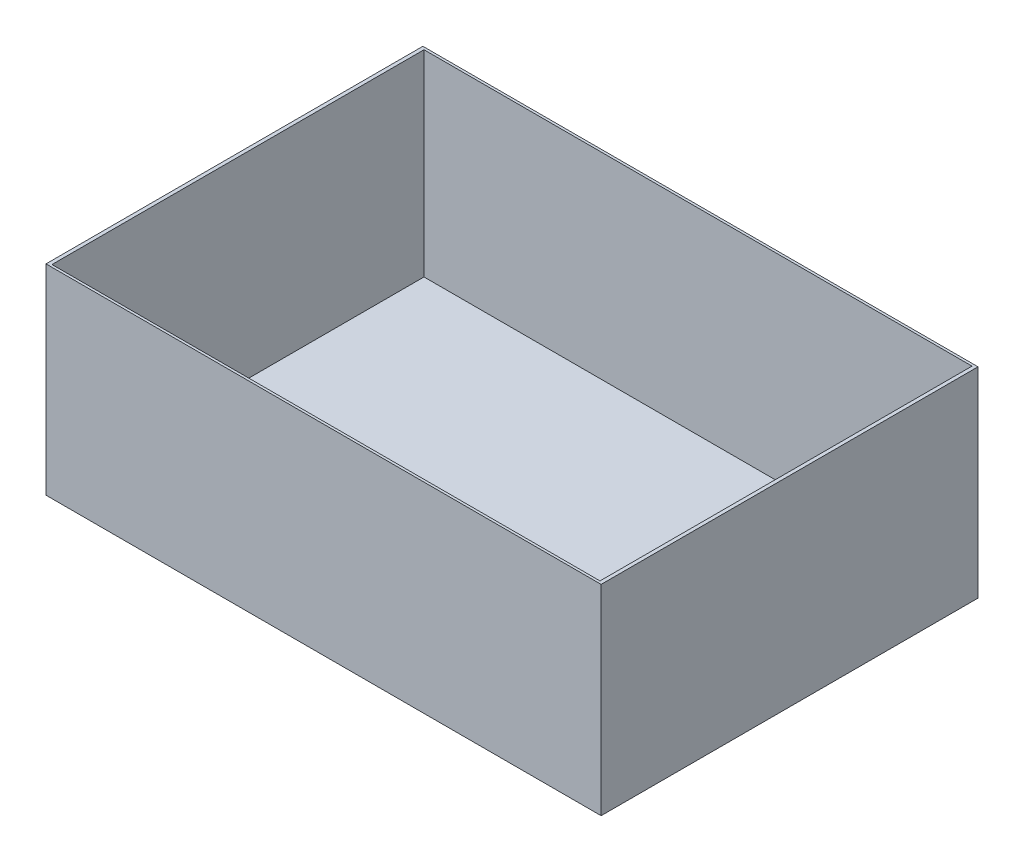
ISO-10303-21;
HEADER;
FILE_DESCRIPTION(('STEP AP214'),'2;1');
FILE_NAME('part.step','',(''),(''),'','','');
FILE_SCHEMA(('AUTOMOTIVE_DESIGN { 1 0 10303 214 1 1 1 1 }'));
ENDSEC;
DATA;
#1=APPLICATION_CONTEXT('core data for automotive mechanical design processes');
#2=APPLICATION_PROTOCOL_DEFINITION('international standard','automotive_design',2000,#1);
#3=PRODUCT_CONTEXT('',#1,'mechanical');
#4=PRODUCT('Part','Part','',(#3));
#5=PRODUCT_RELATED_PRODUCT_CATEGORY('part','',(#4));
#6=PRODUCT_DEFINITION_FORMATION('','',#4);
#7=PRODUCT_DEFINITION_CONTEXT('part definition',#1,'design');
#8=PRODUCT_DEFINITION('design','',#6,#7);
#9=PRODUCT_DEFINITION_SHAPE('','',#8);
#10=(LENGTH_UNIT() NAMED_UNIT(*) SI_UNIT(.MILLI.,.METRE.));
#11=(NAMED_UNIT(*) PLANE_ANGLE_UNIT() SI_UNIT($,.RADIAN.));
#12=(NAMED_UNIT(*) SI_UNIT($,.STERADIAN.) SOLID_ANGLE_UNIT());
#13=UNCERTAINTY_MEASURE_WITH_UNIT(LENGTH_MEASURE(1.E-05),#10,'distance_accuracy_value','');
#14=(GEOMETRIC_REPRESENTATION_CONTEXT(3) GLOBAL_UNCERTAINTY_ASSIGNED_CONTEXT((#13)) GLOBAL_UNIT_ASSIGNED_CONTEXT((#10,
#11,#12)) REPRESENTATION_CONTEXT('',''));
#15=CARTESIAN_POINT('',(0.,0.,0.));
#16=DIRECTION('',(0.,0.,1.));
#17=DIRECTION('',(1.,0.,0.));
#18=AXIS2_PLACEMENT_3D('',#15,#16,#17);
#19=CARTESIAN_POINT('',(249.22,3.2,-169.19));
#20=DIRECTION('',(-1.,0.,0.));
#21=DIRECTION('',(0.,0.,1.));
#22=AXIS2_PLACEMENT_3D('',#19,#20,#21);
#23=PLANE('',#22);
#24=DIRECTION('',(0.,0.,-1.));
#25=VECTOR('',#24,1.);
#26=CARTESIAN_POINT('',(249.22,0.,-169.19));
#27=LINE('',#26,#25);
#28=CARTESIAN_POINT('',(249.22,0.,169.19));
#29=VERTEX_POINT('',#28);
#30=CARTESIAN_POINT('',(249.22,0.,-169.19));
#31=VERTEX_POINT('',#30);
#32=EDGE_CURVE('E173',#29,#31,#27,.T.);
#33=ORIENTED_EDGE('',*,*,#32,.T.);
#34=DIRECTION('',(0.,-1.,0.));
#35=VECTOR('',#34,1.);
#36=CARTESIAN_POINT('',(249.22,3.2,-169.19));
#37=LINE('',#36,#35);
#38=CARTESIAN_POINT('',(249.22,179.9,-169.19));
#39=VERTEX_POINT('',#38);
#40=EDGE_CURVE('E11',#39,#31,#37,.T.);
#41=ORIENTED_EDGE('',*,*,#40,.F.);
#42=DIRECTION('',(0.,0.,-1.));
#43=VECTOR('',#42,1.);
#44=CARTESIAN_POINT('',(249.22,179.9,169.19));
#45=LINE('',#44,#43);
#46=CARTESIAN_POINT('',(249.22,179.9,169.19));
#47=VERTEX_POINT('',#46);
#48=EDGE_CURVE('E126',#47,#39,#45,.T.);
#49=ORIENTED_EDGE('',*,*,#48,.F.);
#50=DIRECTION('',(0.,-1.,0.));
#51=VECTOR('',#50,1.);
#52=CARTESIAN_POINT('',(249.22,3.2,169.19));
#53=LINE('',#52,#51);
#54=EDGE_CURVE('E186',#47,#29,#53,.T.);
#55=ORIENTED_EDGE('',*,*,#54,.T.);
#56=EDGE_LOOP('',(#33,#41,#49,#55));
#57=FACE_BOUND('',#56,.T.);
#58=ADVANCED_FACE('F45',(#57),#23,.F.);
#59=CARTESIAN_POINT('',(-249.22,3.2,-169.19));
#60=DIRECTION('',(0.,0.,1.));
#61=DIRECTION('',(1.,0.,0.));
#62=AXIS2_PLACEMENT_3D('',#59,#60,#61);
#63=PLANE('',#62);
#64=DIRECTION('',(-1.,0.,0.));
#65=VECTOR('',#64,1.);
#66=CARTESIAN_POINT('',(-249.22,0.,-169.19));
#67=LINE('',#66,#65);
#68=CARTESIAN_POINT('',(-249.22,0.,-169.19));
#69=VERTEX_POINT('',#68);
#70=EDGE_CURVE('E177',#31,#69,#67,.T.);
#71=ORIENTED_EDGE('',*,*,#70,.T.);
#72=DIRECTION('',(0.,-1.,0.));
#73=VECTOR('',#72,1.);
#74=CARTESIAN_POINT('',(-249.22,3.2,-169.19));
#75=LINE('',#74,#73);
#76=CARTESIAN_POINT('',(-249.22,179.9,-169.19));
#77=VERTEX_POINT('',#76);
#78=EDGE_CURVE('E53',#77,#69,#75,.T.);
#79=ORIENTED_EDGE('',*,*,#78,.F.);
#80=DIRECTION('',(-1.,0.,0.));
#81=VECTOR('',#80,1.);
#82=CARTESIAN_POINT('',(-249.22,179.9,-169.19));
#83=LINE('',#82,#81);
#84=EDGE_CURVE('E161',#39,#77,#83,.T.);
#85=ORIENTED_EDGE('',*,*,#84,.F.);
#86=ORIENTED_EDGE('',*,*,#40,.T.);
#87=EDGE_LOOP('',(#71,#79,#85,#86));
#88=FACE_BOUND('',#87,.T.);
#89=ADVANCED_FACE('F211',(#88),#63,.F.);
#90=CARTESIAN_POINT('',(-249.22,3.2,-169.19));
#91=DIRECTION('',(1.,0.,0.));
#92=DIRECTION('',(0.,0.,-1.));
#93=AXIS2_PLACEMENT_3D('',#90,#91,#92);
#94=PLANE('',#93);
#95=DIRECTION('',(0.,0.,1.));
#96=VECTOR('',#95,1.);
#97=CARTESIAN_POINT('',(-249.22,0.,-169.19));
#98=LINE('',#97,#96);
#99=CARTESIAN_POINT('',(-249.22,0.,169.19));
#100=VERTEX_POINT('',#99);
#101=EDGE_CURVE('E180',#69,#100,#98,.T.);
#102=ORIENTED_EDGE('',*,*,#101,.T.);
#103=DIRECTION('',(0.,-1.,0.));
#104=VECTOR('',#103,1.);
#105=CARTESIAN_POINT('',(-249.22,3.2,169.19));
#106=LINE('',#105,#104);
#107=CARTESIAN_POINT('',(-249.22,179.9,169.19));
#108=VERTEX_POINT('',#107);
#109=EDGE_CURVE('E190',#108,#100,#106,.T.);
#110=ORIENTED_EDGE('',*,*,#109,.F.);
#111=DIRECTION('',(0.,0.,1.));
#112=VECTOR('',#111,1.);
#113=CARTESIAN_POINT('',(-249.22,179.9,169.19));
#114=LINE('',#113,#112);
#115=EDGE_CURVE('E165',#77,#108,#114,.T.);
#116=ORIENTED_EDGE('',*,*,#115,.F.);
#117=ORIENTED_EDGE('',*,*,#78,.T.);
#118=EDGE_LOOP('',(#102,#110,#116,#117));
#119=FACE_BOUND('',#118,.T.);
#120=ADVANCED_FACE('F198',(#119),#94,.F.);
#121=CARTESIAN_POINT('',(-249.22,3.2,169.19));
#122=DIRECTION('',(0.,0.,-1.));
#123=DIRECTION('',(-1.,0.,0.));
#124=AXIS2_PLACEMENT_3D('',#121,#122,#123);
#125=PLANE('',#124);
#126=DIRECTION('',(1.,0.,0.));
#127=VECTOR('',#126,1.);
#128=CARTESIAN_POINT('',(-249.22,0.,169.19));
#129=LINE('',#128,#127);
#130=EDGE_CURVE('E183',#100,#29,#129,.T.);
#131=ORIENTED_EDGE('',*,*,#130,.T.);
#132=ORIENTED_EDGE('',*,*,#54,.F.);
#133=DIRECTION('',(1.,0.,0.));
#134=VECTOR('',#133,1.);
#135=CARTESIAN_POINT('',(-249.22,179.9,169.19));
#136=LINE('',#135,#134);
#137=EDGE_CURVE('E169',#108,#47,#136,.T.);
#138=ORIENTED_EDGE('',*,*,#137,.F.);
#139=ORIENTED_EDGE('',*,*,#109,.T.);
#140=EDGE_LOOP('',(#131,#132,#138,#139));
#141=FACE_BOUND('',#140,.T.);
#142=ADVANCED_FACE('F206',(#141),#125,.F.);
#143=CARTESIAN_POINT('',(0.,0.,0.));
#144=DIRECTION('',(0.,1.,0.));
#145=DIRECTION('',(0.,0.,1.));
#146=AXIS2_PLACEMENT_3D('',#143,#144,#145);
#147=PLANE('',#146);
#148=ORIENTED_EDGE('',*,*,#32,.F.);
#149=ORIENTED_EDGE('',*,*,#130,.F.);
#150=ORIENTED_EDGE('',*,*,#101,.F.);
#151=ORIENTED_EDGE('',*,*,#70,.F.);
#152=EDGE_LOOP('',(#148,#149,#150,#151));
#153=FACE_BOUND('',#152,.T.);
#154=ADVANCED_FACE('F204',(#153),#147,.F.);
#155=CARTESIAN_POINT('',(0.,179.9,0.));
#156=DIRECTION('',(0.,-1.,0.));
#157=DIRECTION('',(0.,0.,-1.));
#158=AXIS2_PLACEMENT_3D('',#155,#156,#157);
#159=PLANE('',#158);
#160=ORIENTED_EDGE('',*,*,#48,.T.);
#161=ORIENTED_EDGE('',*,*,#84,.T.);
#162=ORIENTED_EDGE('',*,*,#115,.T.);
#163=ORIENTED_EDGE('',*,*,#137,.T.);
#164=EDGE_LOOP('',(#160,#161,#162,#163));
#165=FACE_BOUND('',#164,.T.);
#166=DIRECTION('',(0.,0.,-1.));
#167=VECTOR('',#166,1.);
#168=CARTESIAN_POINT('',(246.02,179.9,167.017590081053));
#169=LINE('',#168,#167);
#170=CARTESIAN_POINT('',(246.02,179.9,167.017590081053));
#171=VERTEX_POINT('',#170);
#172=CARTESIAN_POINT('',(246.02,179.9,-167.017590081053));
#173=VERTEX_POINT('',#172);
#174=EDGE_CURVE('E109',#171,#173,#169,.T.);
#175=ORIENTED_EDGE('',*,*,#174,.F.);
#176=DIRECTION('',(1.,0.,0.));
#177=VECTOR('',#176,1.);
#178=CARTESIAN_POINT('',(-246.02,179.9,167.017590081053));
#179=LINE('',#178,#177);
#180=CARTESIAN_POINT('',(-246.02,179.9,167.017590081053));
#181=VERTEX_POINT('',#180);
#182=EDGE_CURVE('E136',#181,#171,#179,.T.);
#183=ORIENTED_EDGE('',*,*,#182,.F.);
#184=DIRECTION('',(0.,0.,1.));
#185=VECTOR('',#184,1.);
#186=CARTESIAN_POINT('',(-246.02,179.9,167.017590081053));
#187=LINE('',#186,#185);
#188=CARTESIAN_POINT('',(-246.02,179.9,-167.017590081053));
#189=VERTEX_POINT('',#188);
#190=EDGE_CURVE('E132',#189,#181,#187,.T.);
#191=ORIENTED_EDGE('',*,*,#190,.F.);
#192=DIRECTION('',(-1.,0.,0.));
#193=VECTOR('',#192,1.);
#194=CARTESIAN_POINT('',(-246.02,179.9,-167.017590081053));
#195=LINE('',#194,#193);
#196=EDGE_CURVE('E119',#173,#189,#195,.T.);
#197=ORIENTED_EDGE('',*,*,#196,.F.);
#198=EDGE_LOOP('',(#175,#183,#191,#197));
#199=FACE_BOUND('',#198,.T.);
#200=ADVANCED_FACE('F130',(#165,#199),#159,.F.);
#201=CARTESIAN_POINT('',(246.02,179.9,167.017590081053));
#202=DIRECTION('',(-1.,0.,0.));
#203=DIRECTION('',(0.,0.,1.));
#204=AXIS2_PLACEMENT_3D('',#201,#202,#203);
#205=PLANE('',#204);
#206=DIRECTION('',(0.,0.,-1.));
#207=VECTOR('',#206,1.);
#208=CARTESIAN_POINT('',(246.02,3.2,167.017590081053));
#209=LINE('',#208,#207);
#210=CARTESIAN_POINT('',(246.02,3.2,167.017590081053));
#211=VERTEX_POINT('',#210);
#212=CARTESIAN_POINT('',(246.02,3.2,-167.017590081053));
#213=VERTEX_POINT('',#212);
#214=EDGE_CURVE('E60',#211,#213,#209,.T.);
#215=ORIENTED_EDGE('',*,*,#214,.F.);
#216=DIRECTION('',(0.,-1.,0.));
#217=VECTOR('',#216,1.);
#218=CARTESIAN_POINT('',(246.02,179.9,167.017590081053));
#219=LINE('',#218,#217);
#220=EDGE_CURVE('E114',#171,#211,#219,.T.);
#221=ORIENTED_EDGE('',*,*,#220,.F.);
#222=ORIENTED_EDGE('',*,*,#174,.T.);
#223=DIRECTION('',(0.,-1.,0.));
#224=VECTOR('',#223,1.);
#225=CARTESIAN_POINT('',(246.02,179.9,-167.017590081053));
#226=LINE('',#225,#224);
#227=EDGE_CURVE('E112',#173,#213,#226,.T.);
#228=ORIENTED_EDGE('',*,*,#227,.T.);
#229=EDGE_LOOP('',(#215,#221,#222,#228));
#230=FACE_BOUND('',#229,.T.);
#231=ADVANCED_FACE('F111',(#230),#205,.T.);
#232=CARTESIAN_POINT('',(-246.02,179.9,-167.017590081053));
#233=DIRECTION('',(0.,0.,1.));
#234=DIRECTION('',(1.,0.,0.));
#235=AXIS2_PLACEMENT_3D('',#232,#233,#234);
#236=PLANE('',#235);
#237=DIRECTION('',(-1.,0.,0.));
#238=VECTOR('',#237,1.);
#239=CARTESIAN_POINT('',(-246.02,3.2,-167.017590081053));
#240=LINE('',#239,#238);
#241=CARTESIAN_POINT('',(-246.02,3.2,-167.017590081053));
#242=VERTEX_POINT('',#241);
#243=EDGE_CURVE('E64',#213,#242,#240,.T.);
#244=ORIENTED_EDGE('',*,*,#243,.F.);
#245=ORIENTED_EDGE('',*,*,#227,.F.);
#246=ORIENTED_EDGE('',*,*,#196,.T.);
#247=DIRECTION('',(0.,-1.,0.));
#248=VECTOR('',#247,1.);
#249=CARTESIAN_POINT('',(-246.02,179.9,-167.017590081053));
#250=LINE('',#249,#248);
#251=EDGE_CURVE('E127',#189,#242,#250,.T.);
#252=ORIENTED_EDGE('',*,*,#251,.T.);
#253=EDGE_LOOP('',(#244,#245,#246,#252));
#254=FACE_BOUND('',#253,.T.);
#255=ADVANCED_FACE('F123',(#254),#236,.T.);
#256=CARTESIAN_POINT('',(-246.02,179.9,167.017590081053));
#257=DIRECTION('',(1.,0.,0.));
#258=DIRECTION('',(0.,0.,-1.));
#259=AXIS2_PLACEMENT_3D('',#256,#257,#258);
#260=PLANE('',#259);
#261=DIRECTION('',(0.,0.,1.));
#262=VECTOR('',#261,1.);
#263=CARTESIAN_POINT('',(-246.02,3.2,167.017590081053));
#264=LINE('',#263,#262);
#265=CARTESIAN_POINT('',(-246.02,3.2,167.017590081053));
#266=VERTEX_POINT('',#265);
#267=EDGE_CURVE('E145',#242,#266,#264,.T.);
#268=ORIENTED_EDGE('',*,*,#267,.F.);
#269=ORIENTED_EDGE('',*,*,#251,.F.);
#270=ORIENTED_EDGE('',*,*,#190,.T.);
#271=DIRECTION('',(0.,-1.,0.));
#272=VECTOR('',#271,1.);
#273=CARTESIAN_POINT('',(-246.02,179.9,167.017590081053));
#274=LINE('',#273,#272);
#275=EDGE_CURVE('E152',#181,#266,#274,.T.);
#276=ORIENTED_EDGE('',*,*,#275,.T.);
#277=EDGE_LOOP('',(#268,#269,#270,#276));
#278=FACE_BOUND('',#277,.T.);
#279=ADVANCED_FACE('F233',(#278),#260,.T.);
#280=CARTESIAN_POINT('',(-246.02,179.9,167.017590081053));
#281=DIRECTION('',(0.,0.,-1.));
#282=DIRECTION('',(-1.,0.,0.));
#283=AXIS2_PLACEMENT_3D('',#280,#281,#282);
#284=PLANE('',#283);
#285=DIRECTION('',(1.,0.,0.));
#286=VECTOR('',#285,1.);
#287=CARTESIAN_POINT('',(-246.02,3.2,167.017590081053));
#288=LINE('',#287,#286);
#289=EDGE_CURVE('E120',#266,#211,#288,.T.);
#290=ORIENTED_EDGE('',*,*,#289,.F.);
#291=ORIENTED_EDGE('',*,*,#275,.F.);
#292=ORIENTED_EDGE('',*,*,#182,.T.);
#293=ORIENTED_EDGE('',*,*,#220,.T.);
#294=EDGE_LOOP('',(#290,#291,#292,#293));
#295=FACE_BOUND('',#294,.T.);
#296=ADVANCED_FACE('F226',(#295),#284,.T.);
#297=CARTESIAN_POINT('',(0.,3.2,0.));
#298=DIRECTION('',(0.,1.,0.));
#299=DIRECTION('',(0.,0.,1.));
#300=AXIS2_PLACEMENT_3D('',#297,#298,#299);
#301=PLANE('',#300);
#302=ORIENTED_EDGE('',*,*,#214,.T.);
#303=ORIENTED_EDGE('',*,*,#243,.T.);
#304=ORIENTED_EDGE('',*,*,#267,.T.);
#305=ORIENTED_EDGE('',*,*,#289,.T.);
#306=EDGE_LOOP('',(#302,#303,#304,#305));
#307=FACE_BOUND('',#306,.T.);
#308=ADVANCED_FACE('F223',(#307),#301,.T.);
#309=CLOSED_SHELL('',(#58,#89,#120,#142,#154,#200,#231,#255,#279,#296,#308));
#310=MANIFOLD_SOLID_BREP('B2',#309);
#311=ADVANCED_BREP_SHAPE_REPRESENTATION('',(#18,#310),#14);
#312=SHAPE_DEFINITION_REPRESENTATION(#9,#311);
ENDSEC;
END-ISO-10303-21;
